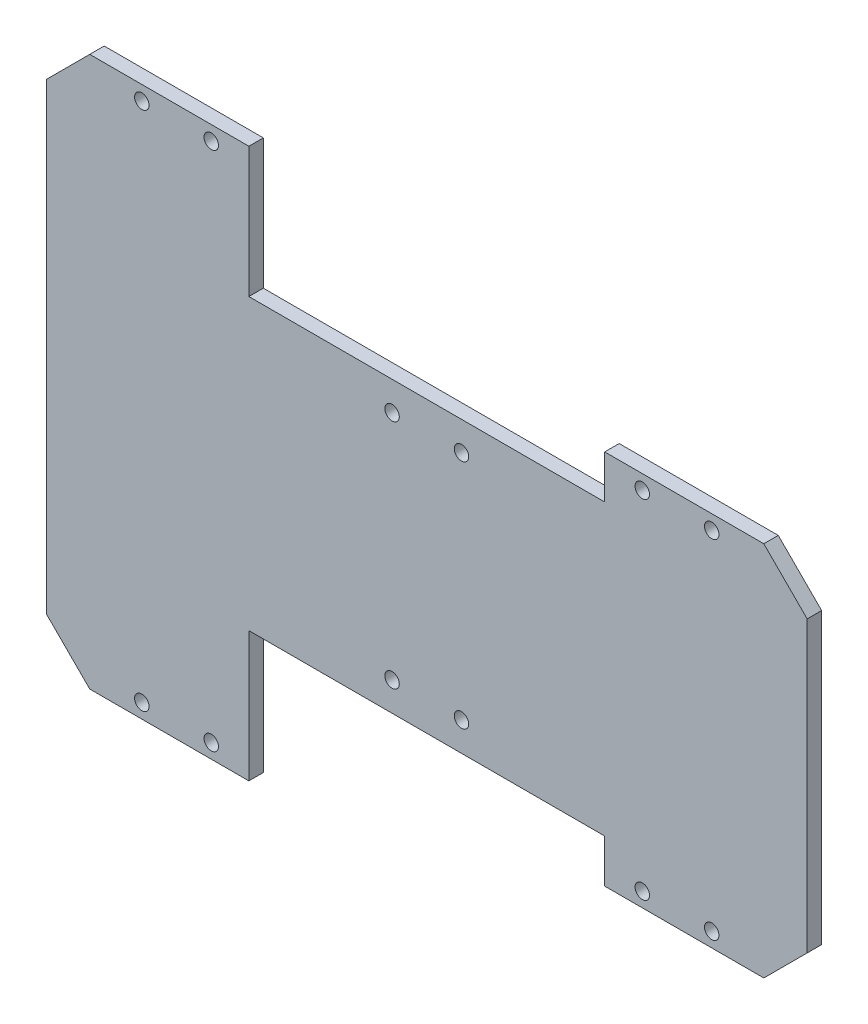
ISO-10303-21;
HEADER;
FILE_DESCRIPTION(('STEP AP214'),'2;1');
FILE_NAME('part.step','',(''),(''),'','','');
FILE_SCHEMA(('AUTOMOTIVE_DESIGN { 1 0 10303 214 1 1 1 1 }'));
ENDSEC;
DATA;
#1=APPLICATION_CONTEXT('core data for automotive mechanical design processes');
#2=APPLICATION_PROTOCOL_DEFINITION('international standard','automotive_design',2000,#1);
#3=PRODUCT_CONTEXT('',#1,'mechanical');
#4=PRODUCT('Part','Part','',(#3));
#5=PRODUCT_RELATED_PRODUCT_CATEGORY('part','',(#4));
#6=PRODUCT_DEFINITION_FORMATION('','',#4);
#7=PRODUCT_DEFINITION_CONTEXT('part definition',#1,'design');
#8=PRODUCT_DEFINITION('design','',#6,#7);
#9=PRODUCT_DEFINITION_SHAPE('','',#8);
#10=(LENGTH_UNIT() NAMED_UNIT(*) SI_UNIT(.MILLI.,.METRE.));
#11=(NAMED_UNIT(*) PLANE_ANGLE_UNIT() SI_UNIT($,.RADIAN.));
#12=(NAMED_UNIT(*) SI_UNIT($,.STERADIAN.) SOLID_ANGLE_UNIT());
#13=UNCERTAINTY_MEASURE_WITH_UNIT(LENGTH_MEASURE(1.E-05),#10,'distance_accuracy_value','');
#14=(GEOMETRIC_REPRESENTATION_CONTEXT(3) GLOBAL_UNCERTAINTY_ASSIGNED_CONTEXT((#13)) GLOBAL_UNIT_ASSIGNED_CONTEXT((#10,
#11,#12)) REPRESENTATION_CONTEXT('',''));
#15=CARTESIAN_POINT('',(0.,0.,0.));
#16=DIRECTION('',(0.,0.,1.));
#17=DIRECTION('',(1.,0.,0.));
#18=AXIS2_PLACEMENT_3D('',#15,#16,#17);
#19=CARTESIAN_POINT('',(-197.069969603607,-105.000000011249,0.));
#20=DIRECTION('',(-0.707106781186552,-0.707106781186543,0.));
#21=DIRECTION('',(0.707106781186543,-0.707106781186552,0.));
#22=AXIS2_PLACEMENT_3D('',#19,#20,#21);
#23=PLANE('',#22);
#24=DIRECTION('',(0.707106781186543,-0.707106781186552,0.));
#25=VECTOR('',#24,1.);
#26=CARTESIAN_POINT('',(-197.069969603607,-105.000000011249,5.));
#27=LINE('',#26,#25);
#28=CARTESIAN_POINT('',(-212.069969578106,-90.00000003675,5.));
#29=VERTEX_POINT('',#28);
#30=CARTESIAN_POINT('',(-197.069969603607,-105.000000011249,5.));
#31=VERTEX_POINT('',#30);
#32=EDGE_CURVE('E192',#29,#31,#27,.T.);
#33=ORIENTED_EDGE('',*,*,#32,.F.);
#34=DIRECTION('',(0.,0.,1.));
#35=VECTOR('',#34,1.);
#36=CARTESIAN_POINT('',(-212.069969578106,-90.00000003675,0.));
#37=LINE('',#36,#35);
#38=CARTESIAN_POINT('',(-212.069969578106,-90.00000003675,0.));
#39=VERTEX_POINT('',#38);
#40=EDGE_CURVE('E11',#39,#29,#37,.T.);
#41=ORIENTED_EDGE('',*,*,#40,.F.);
#42=DIRECTION('',(0.707106781186543,-0.707106781186552,0.));
#43=VECTOR('',#42,1.);
#44=CARTESIAN_POINT('',(-197.069969603607,-105.000000011249,0.));
#45=LINE('',#44,#43);
#46=CARTESIAN_POINT('',(-197.069969603607,-105.000000011249,0.));
#47=VERTEX_POINT('',#46);
#48=EDGE_CURVE('E253',#39,#47,#45,.T.);
#49=ORIENTED_EDGE('',*,*,#48,.T.);
#50=DIRECTION('',(0.,0.,1.));
#51=VECTOR('',#50,1.);
#52=CARTESIAN_POINT('',(-197.069969603607,-105.000000011249,0.));
#53=LINE('',#52,#51);
#54=EDGE_CURVE('E44',#47,#31,#53,.T.);
#55=ORIENTED_EDGE('',*,*,#54,.T.);
#56=EDGE_LOOP('',(#33,#41,#49,#55));
#57=FACE_BOUND('',#56,.T.);
#58=ADVANCED_FACE('F41',(#57),#23,.T.);
#59=CARTESIAN_POINT('',(-212.069969578105,70.0000000142508,0.));
#60=DIRECTION('',(-1.,0.,0.));
#61=DIRECTION('',(0.,-1.,0.));
#62=AXIS2_PLACEMENT_3D('',#59,#60,#61);
#63=PLANE('',#62);
#64=DIRECTION('',(0.,-1.,0.));
#65=VECTOR('',#64,1.);
#66=CARTESIAN_POINT('',(-212.069969578105,70.0000000142508,5.));
#67=LINE('',#66,#65);
#68=CARTESIAN_POINT('',(-212.069969578105,70.0000000142508,5.));
#69=VERTEX_POINT('',#68);
#70=EDGE_CURVE('E250',#69,#29,#67,.T.);
#71=ORIENTED_EDGE('',*,*,#70,.F.);
#72=DIRECTION('',(0.,0.,1.));
#73=VECTOR('',#72,1.);
#74=CARTESIAN_POINT('',(-212.069969578105,70.0000000142508,0.));
#75=LINE('',#74,#73);
#76=CARTESIAN_POINT('',(-212.069969578105,70.0000000142508,0.));
#77=VERTEX_POINT('',#76);
#78=EDGE_CURVE('E51',#77,#69,#75,.T.);
#79=ORIENTED_EDGE('',*,*,#78,.F.);
#80=DIRECTION('',(0.,-1.,0.));
#81=VECTOR('',#80,1.);
#82=CARTESIAN_POINT('',(-212.069969578105,70.0000000142508,0.));
#83=LINE('',#82,#81);
#84=EDGE_CURVE('E178',#77,#39,#83,.T.);
#85=ORIENTED_EDGE('',*,*,#84,.T.);
#86=ORIENTED_EDGE('',*,*,#40,.T.);
#87=EDGE_LOOP('',(#71,#79,#85,#86));
#88=FACE_BOUND('',#87,.T.);
#89=ADVANCED_FACE('F295',(#88),#63,.T.);
#90=CARTESIAN_POINT('',(-197.069969603606,84.99999998875,0.));
#91=DIRECTION('',(-0.707106781186549,0.707106781186546,0.));
#92=DIRECTION('',(-0.707106781186546,-0.707106781186549,0.));
#93=AXIS2_PLACEMENT_3D('',#90,#91,#92);
#94=PLANE('',#93);
#95=DIRECTION('',(-0.707106781186546,-0.707106781186549,0.));
#96=VECTOR('',#95,1.);
#97=CARTESIAN_POINT('',(-197.069969603606,84.99999998875,5.));
#98=LINE('',#97,#96);
#99=CARTESIAN_POINT('',(-197.069969603606,84.99999998875,5.));
#100=VERTEX_POINT('',#99);
#101=EDGE_CURVE('E164',#100,#69,#98,.T.);
#102=ORIENTED_EDGE('',*,*,#101,.F.);
#103=DIRECTION('',(0.,0.,1.));
#104=VECTOR('',#103,1.);
#105=CARTESIAN_POINT('',(-197.069969603606,84.99999998875,0.));
#106=LINE('',#105,#104);
#107=CARTESIAN_POINT('',(-197.069969603606,84.99999998875,0.));
#108=VERTEX_POINT('',#107);
#109=EDGE_CURVE('E159',#108,#100,#106,.T.);
#110=ORIENTED_EDGE('',*,*,#109,.F.);
#111=DIRECTION('',(-0.707106781186546,-0.707106781186549,0.));
#112=VECTOR('',#111,1.);
#113=CARTESIAN_POINT('',(-197.069969603606,84.99999998875,0.));
#114=LINE('',#113,#112);
#115=EDGE_CURVE('E162',#108,#77,#114,.T.);
#116=ORIENTED_EDGE('',*,*,#115,.T.);
#117=ORIENTED_EDGE('',*,*,#78,.T.);
#118=EDGE_LOOP('',(#102,#110,#116,#117));
#119=FACE_BOUND('',#118,.T.);
#120=ADVANCED_FACE('F161',(#119),#94,.T.);
#121=CARTESIAN_POINT('',(-142.069969573605,84.9999999887507,0.));
#122=DIRECTION('',(0.,1.,0.));
#123=DIRECTION('',(-1.,0.,0.));
#124=AXIS2_PLACEMENT_3D('',#121,#122,#123);
#125=PLANE('',#124);
#126=DIRECTION('',(-1.,0.,0.));
#127=VECTOR('',#126,1.);
#128=CARTESIAN_POINT('',(-142.069969573605,84.9999999887507,5.));
#129=LINE('',#128,#127);
#130=CARTESIAN_POINT('',(-142.069969573605,84.9999999887507,5.));
#131=VERTEX_POINT('',#130);
#132=EDGE_CURVE('E245',#131,#100,#129,.T.);
#133=ORIENTED_EDGE('',*,*,#132,.F.);
#134=DIRECTION('',(0.,0.,1.));
#135=VECTOR('',#134,1.);
#136=CARTESIAN_POINT('',(-142.069969573605,84.9999999887507,0.));
#137=LINE('',#136,#135);
#138=CARTESIAN_POINT('',(-142.069969573605,84.9999999887507,0.));
#139=VERTEX_POINT('',#138);
#140=EDGE_CURVE('E170',#139,#131,#137,.T.);
#141=ORIENTED_EDGE('',*,*,#140,.F.);
#142=DIRECTION('',(-1.,0.,0.));
#143=VECTOR('',#142,1.);
#144=CARTESIAN_POINT('',(-142.069969573605,84.9999999887507,0.));
#145=LINE('',#144,#143);
#146=EDGE_CURVE('E176',#139,#108,#145,.T.);
#147=ORIENTED_EDGE('',*,*,#146,.T.);
#148=ORIENTED_EDGE('',*,*,#109,.T.);
#149=EDGE_LOOP('',(#133,#141,#147,#148));
#150=FACE_BOUND('',#149,.T.);
#151=ADVANCED_FACE('F181',(#150),#125,.T.);
#152=CARTESIAN_POINT('',(-142.069969573605,39.9999999887507,0.));
#153=DIRECTION('',(1.,0.,0.));
#154=DIRECTION('',(0.,0.,-1.));
#155=AXIS2_PLACEMENT_3D('',#152,#153,#154);
#156=PLANE('',#155);
#157=DIRECTION('',(0.,1.,0.));
#158=VECTOR('',#157,1.);
#159=CARTESIAN_POINT('',(-142.069969573605,39.9999999887507,5.));
#160=LINE('',#159,#158);
#161=CARTESIAN_POINT('',(-142.069969573605,39.9999999887507,5.));
#162=VERTEX_POINT('',#161);
#163=EDGE_CURVE('E241',#162,#131,#160,.T.);
#164=ORIENTED_EDGE('',*,*,#163,.F.);
#165=DIRECTION('',(0.,0.,1.));
#166=VECTOR('',#165,1.);
#167=CARTESIAN_POINT('',(-142.069969573605,39.9999999887507,0.));
#168=LINE('',#167,#166);
#169=CARTESIAN_POINT('',(-142.069969573605,39.9999999887507,0.));
#170=VERTEX_POINT('',#169);
#171=EDGE_CURVE('E259',#170,#162,#168,.T.);
#172=ORIENTED_EDGE('',*,*,#171,.F.);
#173=DIRECTION('',(0.,1.,0.));
#174=VECTOR('',#173,1.);
#175=CARTESIAN_POINT('',(-142.069969573605,39.9999999887507,0.));
#176=LINE('',#175,#174);
#177=EDGE_CURVE('E183',#170,#139,#176,.T.);
#178=ORIENTED_EDGE('',*,*,#177,.T.);
#179=ORIENTED_EDGE('',*,*,#140,.T.);
#180=EDGE_LOOP('',(#164,#172,#178,#179));
#181=FACE_BOUND('',#180,.T.);
#182=ADVANCED_FACE('F308',(#181),#156,.T.);
#183=CARTESIAN_POINT('',(-19.0699695664799,39.99999998875,0.));
#184=DIRECTION('',(0.,1.,0.));
#185=DIRECTION('',(-1.,0.,0.));
#186=AXIS2_PLACEMENT_3D('',#183,#184,#185);
#187=PLANE('',#186);
#188=DIRECTION('',(-1.,0.,0.));
#189=VECTOR('',#188,1.);
#190=CARTESIAN_POINT('',(-19.0699695664799,39.99999998875,5.));
#191=LINE('',#190,#189);
#192=CARTESIAN_POINT('',(-19.0699695664799,39.99999998875,5.));
#193=VERTEX_POINT('',#192);
#194=EDGE_CURVE('E237',#193,#162,#191,.T.);
#195=ORIENTED_EDGE('',*,*,#194,.F.);
#196=DIRECTION('',(0.,0.,1.));
#197=VECTOR('',#196,1.);
#198=CARTESIAN_POINT('',(-19.0699695664799,39.99999998875,0.));
#199=LINE('',#198,#197);
#200=CARTESIAN_POINT('',(-19.0699695664799,39.99999998875,0.));
#201=VERTEX_POINT('',#200);
#202=EDGE_CURVE('E262',#201,#193,#199,.T.);
#203=ORIENTED_EDGE('',*,*,#202,.F.);
#204=DIRECTION('',(-1.,0.,0.));
#205=VECTOR('',#204,1.);
#206=CARTESIAN_POINT('',(-19.0699695664799,39.99999998875,0.));
#207=LINE('',#206,#205);
#208=EDGE_CURVE('E186',#201,#170,#207,.T.);
#209=ORIENTED_EDGE('',*,*,#208,.T.);
#210=ORIENTED_EDGE('',*,*,#171,.T.);
#211=EDGE_LOOP('',(#195,#203,#209,#210));
#212=FACE_BOUND('',#211,.T.);
#213=ADVANCED_FACE('F311',(#212),#187,.T.);
#214=CARTESIAN_POINT('',(-19.0699695664799,54.99999993775,0.));
#215=DIRECTION('',(-1.,0.,0.));
#216=DIRECTION('',(0.,-1.,0.));
#217=AXIS2_PLACEMENT_3D('',#214,#215,#216);
#218=PLANE('',#217);
#219=DIRECTION('',(0.,-1.,0.));
#220=VECTOR('',#219,1.);
#221=CARTESIAN_POINT('',(-19.0699695664799,54.99999993775,5.));
#222=LINE('',#221,#220);
#223=CARTESIAN_POINT('',(-19.0699695664799,54.99999993775,5.));
#224=VERTEX_POINT('',#223);
#225=EDGE_CURVE('E233',#224,#193,#222,.T.);
#226=ORIENTED_EDGE('',*,*,#225,.F.);
#227=DIRECTION('',(0.,0.,1.));
#228=VECTOR('',#227,1.);
#229=CARTESIAN_POINT('',(-19.0699695664799,54.99999993775,0.));
#230=LINE('',#229,#228);
#231=CARTESIAN_POINT('',(-19.0699695664799,54.99999993775,0.));
#232=VERTEX_POINT('',#231);
#233=EDGE_CURVE('E265',#232,#224,#230,.T.);
#234=ORIENTED_EDGE('',*,*,#233,.F.);
#235=DIRECTION('',(0.,-1.,0.));
#236=VECTOR('',#235,1.);
#237=CARTESIAN_POINT('',(-19.0699695664799,54.99999993775,0.));
#238=LINE('',#237,#236);
#239=EDGE_CURVE('E547',#232,#201,#238,.T.);
#240=ORIENTED_EDGE('',*,*,#239,.T.);
#241=ORIENTED_EDGE('',*,*,#202,.T.);
#242=EDGE_LOOP('',(#226,#234,#240,#241));
#243=FACE_BOUND('',#242,.T.);
#244=ADVANCED_FACE('F315',(#243),#218,.T.);
#245=CARTESIAN_POINT('',(35.9300304361448,54.99999993775,0.));
#246=DIRECTION('',(0.,1.,0.));
#247=DIRECTION('',(0.,0.,1.));
#248=AXIS2_PLACEMENT_3D('',#245,#246,#247);
#249=PLANE('',#248);
#250=DIRECTION('',(-1.,0.,0.));
#251=VECTOR('',#250,1.);
#252=CARTESIAN_POINT('',(35.9300304361448,54.99999993775,5.));
#253=LINE('',#252,#251);
#254=CARTESIAN_POINT('',(35.9300304361448,54.99999993775,5.));
#255=VERTEX_POINT('',#254);
#256=EDGE_CURVE('E229',#255,#224,#253,.T.);
#257=ORIENTED_EDGE('',*,*,#256,.F.);
#258=DIRECTION('',(0.,0.,1.));
#259=VECTOR('',#258,1.);
#260=CARTESIAN_POINT('',(35.9300304361448,54.99999993775,0.));
#261=LINE('',#260,#259);
#262=CARTESIAN_POINT('',(35.9300304361448,54.99999993775,0.));
#263=VERTEX_POINT('',#262);
#264=EDGE_CURVE('E268',#263,#255,#261,.T.);
#265=ORIENTED_EDGE('',*,*,#264,.F.);
#266=DIRECTION('',(-1.,0.,0.));
#267=VECTOR('',#266,1.);
#268=CARTESIAN_POINT('',(35.9300304361448,54.99999993775,0.));
#269=LINE('',#268,#267);
#270=EDGE_CURVE('E543',#263,#232,#269,.T.);
#271=ORIENTED_EDGE('',*,*,#270,.T.);
#272=ORIENTED_EDGE('',*,*,#233,.T.);
#273=EDGE_LOOP('',(#257,#265,#271,#272));
#274=FACE_BOUND('',#273,.T.);
#275=ADVANCED_FACE('F319',(#274),#249,.T.);
#276=CARTESIAN_POINT('',(50.9300304361448,39.99999993775,0.));
#277=DIRECTION('',(0.707106781186548,0.707106781186547,0.));
#278=DIRECTION('',(-0.707106781186547,0.707106781186548,0.));
#279=AXIS2_PLACEMENT_3D('',#276,#277,#278);
#280=PLANE('',#279);
#281=DIRECTION('',(-0.707106781186547,0.707106781186548,0.));
#282=VECTOR('',#281,1.);
#283=CARTESIAN_POINT('',(50.9300304361448,39.99999993775,5.));
#284=LINE('',#283,#282);
#285=CARTESIAN_POINT('',(50.9300304361448,39.99999993775,5.));
#286=VERTEX_POINT('',#285);
#287=EDGE_CURVE('E225',#286,#255,#284,.T.);
#288=ORIENTED_EDGE('',*,*,#287,.F.);
#289=DIRECTION('',(0.,0.,1.));
#290=VECTOR('',#289,1.);
#291=CARTESIAN_POINT('',(50.9300304361448,39.99999993775,0.));
#292=LINE('',#291,#290);
#293=CARTESIAN_POINT('',(50.9300304361448,39.99999993775,0.));
#294=VERTEX_POINT('',#293);
#295=EDGE_CURVE('E271',#294,#286,#292,.T.);
#296=ORIENTED_EDGE('',*,*,#295,.F.);
#297=DIRECTION('',(-0.707106781186547,0.707106781186548,0.));
#298=VECTOR('',#297,1.);
#299=CARTESIAN_POINT('',(50.9300304361448,39.99999993775,0.));
#300=LINE('',#299,#298);
#301=EDGE_CURVE('E539',#294,#263,#300,.T.);
#302=ORIENTED_EDGE('',*,*,#301,.T.);
#303=ORIENTED_EDGE('',*,*,#264,.T.);
#304=EDGE_LOOP('',(#288,#296,#302,#303));
#305=FACE_BOUND('',#304,.T.);
#306=ADVANCED_FACE('F323',(#305),#280,.T.);
#307=CARTESIAN_POINT('',(50.9300304361446,-59.9999999602504,0.));
#308=DIRECTION('',(1.,0.,0.));
#309=DIRECTION('',(0.,1.,0.));
#310=AXIS2_PLACEMENT_3D('',#307,#308,#309);
#311=PLANE('',#310);
#312=DIRECTION('',(0.,1.,0.));
#313=VECTOR('',#312,1.);
#314=CARTESIAN_POINT('',(50.9300304361446,-59.9999999602504,5.));
#315=LINE('',#314,#313);
#316=CARTESIAN_POINT('',(50.9300304361446,-59.9999999602504,5.));
#317=VERTEX_POINT('',#316);
#318=EDGE_CURVE('E221',#317,#286,#315,.T.);
#319=ORIENTED_EDGE('',*,*,#318,.F.);
#320=DIRECTION('',(0.,0.,1.));
#321=VECTOR('',#320,1.);
#322=CARTESIAN_POINT('',(50.9300304361446,-59.9999999602504,0.));
#323=LINE('',#322,#321);
#324=CARTESIAN_POINT('',(50.9300304361446,-59.9999999602504,0.));
#325=VERTEX_POINT('',#324);
#326=EDGE_CURVE('E274',#325,#317,#323,.T.);
#327=ORIENTED_EDGE('',*,*,#326,.F.);
#328=DIRECTION('',(0.,1.,0.));
#329=VECTOR('',#328,1.);
#330=CARTESIAN_POINT('',(50.9300304361446,-59.9999999602504,0.));
#331=LINE('',#330,#329);
#332=EDGE_CURVE('E535',#325,#294,#331,.T.);
#333=ORIENTED_EDGE('',*,*,#332,.T.);
#334=ORIENTED_EDGE('',*,*,#295,.T.);
#335=EDGE_LOOP('',(#319,#327,#333,#334));
#336=FACE_BOUND('',#335,.T.);
#337=ADVANCED_FACE('F327',(#336),#311,.T.);
#338=CARTESIAN_POINT('',(50.9300304361446,-59.9999999602504,0.));
#339=DIRECTION('',(0.707106781186546,-0.707106781186549,0.));
#340=DIRECTION('',(0.707106781186549,0.707106781186546,0.));
#341=AXIS2_PLACEMENT_3D('',#338,#339,#340);
#342=PLANE('',#341);
#343=DIRECTION('',(0.707106781186549,0.707106781186546,0.));
#344=VECTOR('',#343,1.);
#345=CARTESIAN_POINT('',(50.9300304361446,-59.9999999602504,5.));
#346=LINE('',#345,#344);
#347=CARTESIAN_POINT('',(35.9300304361445,-74.9999999602503,5.));
#348=VERTEX_POINT('',#347);
#349=EDGE_CURVE('E217',#348,#317,#346,.T.);
#350=ORIENTED_EDGE('',*,*,#349,.F.);
#351=DIRECTION('',(0.,0.,1.));
#352=VECTOR('',#351,1.);
#353=CARTESIAN_POINT('',(35.9300304361445,-74.9999999602503,0.));
#354=LINE('',#353,#352);
#355=CARTESIAN_POINT('',(35.9300304361445,-74.9999999602503,0.));
#356=VERTEX_POINT('',#355);
#357=EDGE_CURVE('E277',#356,#348,#354,.T.);
#358=ORIENTED_EDGE('',*,*,#357,.F.);
#359=DIRECTION('',(0.707106781186549,0.707106781186546,0.));
#360=VECTOR('',#359,1.);
#361=CARTESIAN_POINT('',(50.9300304361446,-59.9999999602504,0.));
#362=LINE('',#361,#360);
#363=EDGE_CURVE('E531',#356,#325,#362,.T.);
#364=ORIENTED_EDGE('',*,*,#363,.T.);
#365=ORIENTED_EDGE('',*,*,#326,.T.);
#366=EDGE_LOOP('',(#350,#358,#364,#365));
#367=FACE_BOUND('',#366,.T.);
#368=ADVANCED_FACE('F331',(#367),#342,.T.);
#369=CARTESIAN_POINT('',(35.9300304361445,-74.9999999602503,0.));
#370=DIRECTION('',(0.,-1.,0.));
#371=DIRECTION('',(1.,0.,0.));
#372=AXIS2_PLACEMENT_3D('',#369,#370,#371);
#373=PLANE('',#372);
#374=DIRECTION('',(1.,0.,0.));
#375=VECTOR('',#374,1.);
#376=CARTESIAN_POINT('',(35.9300304361445,-74.9999999602503,5.));
#377=LINE('',#376,#375);
#378=CARTESIAN_POINT('',(-19.0699695664801,-74.9999999602501,5.));
#379=VERTEX_POINT('',#378);
#380=EDGE_CURVE('E213',#379,#348,#377,.T.);
#381=ORIENTED_EDGE('',*,*,#380,.F.);
#382=DIRECTION('',(0.,0.,1.));
#383=VECTOR('',#382,1.);
#384=CARTESIAN_POINT('',(-19.0699695664801,-74.9999999602501,0.));
#385=LINE('',#384,#383);
#386=CARTESIAN_POINT('',(-19.0699695664801,-74.9999999602501,0.));
#387=VERTEX_POINT('',#386);
#388=EDGE_CURVE('E280',#387,#379,#385,.T.);
#389=ORIENTED_EDGE('',*,*,#388,.F.);
#390=DIRECTION('',(1.,0.,0.));
#391=VECTOR('',#390,1.);
#392=CARTESIAN_POINT('',(35.9300304361445,-74.9999999602503,0.));
#393=LINE('',#392,#391);
#394=EDGE_CURVE('E527',#387,#356,#393,.T.);
#395=ORIENTED_EDGE('',*,*,#394,.T.);
#396=ORIENTED_EDGE('',*,*,#357,.T.);
#397=EDGE_LOOP('',(#381,#389,#395,#396));
#398=FACE_BOUND('',#397,.T.);
#399=ADVANCED_FACE('F335',(#398),#373,.T.);
#400=CARTESIAN_POINT('',(-19.0699695664801,-74.9999999602501,0.));
#401=DIRECTION('',(-1.,0.,0.));
#402=DIRECTION('',(0.,-1.,0.));
#403=AXIS2_PLACEMENT_3D('',#400,#401,#402);
#404=PLANE('',#403);
#405=DIRECTION('',(0.,-1.,0.));
#406=VECTOR('',#405,1.);
#407=CARTESIAN_POINT('',(-19.0699695664801,-74.9999999602501,5.));
#408=LINE('',#407,#406);
#409=CARTESIAN_POINT('',(-19.0699695664801,-60.0000000112501,5.));
#410=VERTEX_POINT('',#409);
#411=EDGE_CURVE('E209',#410,#379,#408,.T.);
#412=ORIENTED_EDGE('',*,*,#411,.F.);
#413=DIRECTION('',(0.,0.,1.));
#414=VECTOR('',#413,1.);
#415=CARTESIAN_POINT('',(-19.0699695664801,-60.0000000112501,0.));
#416=LINE('',#415,#414);
#417=CARTESIAN_POINT('',(-19.0699695664801,-60.0000000112501,0.));
#418=VERTEX_POINT('',#417);
#419=EDGE_CURVE('E283',#418,#410,#416,.T.);
#420=ORIENTED_EDGE('',*,*,#419,.F.);
#421=DIRECTION('',(0.,-1.,0.));
#422=VECTOR('',#421,1.);
#423=CARTESIAN_POINT('',(-19.0699695664801,-74.9999999602501,0.));
#424=LINE('',#423,#422);
#425=EDGE_CURVE('E523',#418,#387,#424,.T.);
#426=ORIENTED_EDGE('',*,*,#425,.T.);
#427=ORIENTED_EDGE('',*,*,#388,.T.);
#428=EDGE_LOOP('',(#412,#420,#426,#427));
#429=FACE_BOUND('',#428,.T.);
#430=ADVANCED_FACE('F339',(#429),#404,.T.);
#431=CARTESIAN_POINT('',(-19.0699695664801,-60.0000000112501,0.));
#432=DIRECTION('',(0.,-1.,0.));
#433=DIRECTION('',(1.,0.,0.));
#434=AXIS2_PLACEMENT_3D('',#431,#432,#433);
#435=PLANE('',#434);
#436=DIRECTION('',(1.,0.,0.));
#437=VECTOR('',#436,1.);
#438=CARTESIAN_POINT('',(-19.0699695664801,-60.0000000112501,5.));
#439=LINE('',#438,#437);
#440=CARTESIAN_POINT('',(-142.069969573605,-60.0000000112502,5.));
#441=VERTEX_POINT('',#440);
#442=EDGE_CURVE('E205',#441,#410,#439,.T.);
#443=ORIENTED_EDGE('',*,*,#442,.F.);
#444=DIRECTION('',(0.,0.,1.));
#445=VECTOR('',#444,1.);
#446=CARTESIAN_POINT('',(-142.069969573605,-60.0000000112502,0.));
#447=LINE('',#446,#445);
#448=CARTESIAN_POINT('',(-142.069969573605,-60.0000000112502,0.));
#449=VERTEX_POINT('',#448);
#450=EDGE_CURVE('E286',#449,#441,#447,.T.);
#451=ORIENTED_EDGE('',*,*,#450,.F.);
#452=DIRECTION('',(1.,0.,0.));
#453=VECTOR('',#452,1.);
#454=CARTESIAN_POINT('',(-19.0699695664801,-60.0000000112501,0.));
#455=LINE('',#454,#453);
#456=EDGE_CURVE('E519',#449,#418,#455,.T.);
#457=ORIENTED_EDGE('',*,*,#456,.T.);
#458=ORIENTED_EDGE('',*,*,#419,.T.);
#459=EDGE_LOOP('',(#443,#451,#457,#458));
#460=FACE_BOUND('',#459,.T.);
#461=ADVANCED_FACE('F343',(#460),#435,.T.);
#462=CARTESIAN_POINT('',(-142.069969573605,-60.0000000112502,0.));
#463=DIRECTION('',(1.,0.,0.));
#464=DIRECTION('',(0.,1.,0.));
#465=AXIS2_PLACEMENT_3D('',#462,#463,#464);
#466=PLANE('',#465);
#467=DIRECTION('',(0.,1.,0.));
#468=VECTOR('',#467,1.);
#469=CARTESIAN_POINT('',(-142.069969573605,-60.0000000112502,5.));
#470=LINE('',#469,#468);
#471=CARTESIAN_POINT('',(-142.069969573605,-105.00000001125,5.));
#472=VERTEX_POINT('',#471);
#473=EDGE_CURVE('E201',#472,#441,#470,.T.);
#474=ORIENTED_EDGE('',*,*,#473,.F.);
#475=DIRECTION('',(0.,0.,1.));
#476=VECTOR('',#475,1.);
#477=CARTESIAN_POINT('',(-142.069969573605,-105.00000001125,0.));
#478=LINE('',#477,#476);
#479=CARTESIAN_POINT('',(-142.069969573605,-105.00000001125,0.));
#480=VERTEX_POINT('',#479);
#481=EDGE_CURVE('E288',#480,#472,#478,.T.);
#482=ORIENTED_EDGE('',*,*,#481,.F.);
#483=DIRECTION('',(0.,1.,0.));
#484=VECTOR('',#483,1.);
#485=CARTESIAN_POINT('',(-142.069969573605,-60.0000000112502,0.));
#486=LINE('',#485,#484);
#487=EDGE_CURVE('E515',#480,#449,#486,.T.);
#488=ORIENTED_EDGE('',*,*,#487,.T.);
#489=ORIENTED_EDGE('',*,*,#450,.T.);
#490=EDGE_LOOP('',(#474,#482,#488,#489));
#491=FACE_BOUND('',#490,.T.);
#492=ADVANCED_FACE('F347',(#491),#466,.T.);
#493=CARTESIAN_POINT('',(-142.069969573605,-105.00000001125,0.));
#494=DIRECTION('',(0.,-1.,0.));
#495=DIRECTION('',(1.,0.,0.));
#496=AXIS2_PLACEMENT_3D('',#493,#494,#495);
#497=PLANE('',#496);
#498=DIRECTION('',(1.,0.,0.));
#499=VECTOR('',#498,1.);
#500=CARTESIAN_POINT('',(-142.069969573605,-105.00000001125,5.));
#501=LINE('',#500,#499);
#502=EDGE_CURVE('E196',#31,#472,#501,.T.);
#503=ORIENTED_EDGE('',*,*,#502,.F.);
#504=ORIENTED_EDGE('',*,*,#54,.F.);
#505=DIRECTION('',(1.,0.,0.));
#506=VECTOR('',#505,1.);
#507=CARTESIAN_POINT('',(-142.069969573605,-105.00000001125,0.));
#508=LINE('',#507,#506);
#509=EDGE_CURVE('E512',#47,#480,#508,.T.);
#510=ORIENTED_EDGE('',*,*,#509,.T.);
#511=ORIENTED_EDGE('',*,*,#481,.T.);
#512=EDGE_LOOP('',(#503,#504,#510,#511));
#513=FACE_BOUND('',#512,.T.);
#514=ADVANCED_FACE('F292',(#513),#497,.T.);
#515=CARTESIAN_POINT('',(0.,0.,0.));
#516=DIRECTION('',(0.,0.,1.));
#517=DIRECTION('',(1.,0.,0.));
#518=AXIS2_PLACEMENT_3D('',#515,#516,#517);
#519=PLANE('',#518);
#520=CARTESIAN_POINT('',(17.9300304335202,49.9999999377477,0.));
#521=DIRECTION('',(0.,0.,1.));
#522=DIRECTION('',(1.,0.,0.));
#523=AXIS2_PLACEMENT_3D('',#520,#521,#522);
#524=CIRCLE('',#523,2.50000000000132);
#525=CARTESIAN_POINT('',(20.4300304335215,49.9999999377477,0.));
#526=VERTEX_POINT('',#525);
#527=EDGE_CURVE('E414',#526,#526,#524,.T.);
#528=ORIENTED_EDGE('',*,*,#527,.T.);
#529=EDGE_LOOP('',(#528));
#530=FACE_BOUND('',#529,.T.);
#531=CARTESIAN_POINT('',(-179.069969573605,79.99999998875,0.));
#532=DIRECTION('',(0.,0.,1.));
#533=DIRECTION('',(1.,0.,0.));
#534=AXIS2_PLACEMENT_3D('',#531,#532,#533);
#535=CIRCLE('',#534,2.5);
#536=CARTESIAN_POINT('',(-176.569969573605,79.99999998875,0.));
#537=VERTEX_POINT('',#536);
#538=EDGE_CURVE('E424',#537,#537,#535,.T.);
#539=ORIENTED_EDGE('',*,*,#538,.T.);
#540=EDGE_LOOP('',(#539));
#541=FACE_BOUND('',#540,.T.);
#542=CARTESIAN_POINT('',(-179.069969573605,-100.000000011249,0.));
#543=DIRECTION('',(0.,0.,1.));
#544=DIRECTION('',(-1.,0.,0.));
#545=AXIS2_PLACEMENT_3D('',#542,#543,#544);
#546=CIRCLE('',#545,2.5);
#547=CARTESIAN_POINT('',(-181.569969573605,-100.000000011249,0.));
#548=VERTEX_POINT('',#547);
#549=EDGE_CURVE('E432',#548,#548,#546,.T.);
#550=ORIENTED_EDGE('',*,*,#549,.T.);
#551=EDGE_LOOP('',(#550));
#552=FACE_BOUND('',#551,.T.);
#553=CARTESIAN_POINT('',(-68.5699695781056,30.0000000004351,0.));
#554=DIRECTION('',(0.,0.,1.));
#555=DIRECTION('',(-1.,0.,0.));
#556=AXIS2_PLACEMENT_3D('',#553,#554,#555);
#557=CIRCLE('',#556,2.50000000000001);
#558=CARTESIAN_POINT('',(-71.0699695781056,30.0000000004351,0.));
#559=VERTEX_POINT('',#558);
#560=EDGE_CURVE('E440',#559,#559,#557,.T.);
#561=ORIENTED_EDGE('',*,*,#560,.T.);
#562=EDGE_LOOP('',(#561));
#563=FACE_BOUND('',#562,.T.);
#564=CARTESIAN_POINT('',(-92.5699695781056,30.0000000116851,0.));
#565=DIRECTION('',(0.,0.,1.));
#566=DIRECTION('',(-1.,0.,0.));
#567=AXIS2_PLACEMENT_3D('',#564,#565,#566);
#568=CIRCLE('',#567,2.49999999999999);
#569=CARTESIAN_POINT('',(-95.0699695781056,30.0000000116851,0.));
#570=VERTEX_POINT('',#569);
#571=EDGE_CURVE('E448',#570,#570,#568,.T.);
#572=ORIENTED_EDGE('',*,*,#571,.T.);
#573=EDGE_LOOP('',(#572));
#574=FACE_BOUND('',#573,.T.);
#575=CARTESIAN_POINT('',(-6.06996956647969,-69.9999999602509,0.));
#576=DIRECTION('',(0.,0.,1.));
#577=DIRECTION('',(1.,0.,0.));
#578=AXIS2_PLACEMENT_3D('',#575,#576,#577);
#579=CIRCLE('',#578,2.50000000000001);
#580=CARTESIAN_POINT('',(-3.56996956647968,-69.9999999602509,0.));
#581=VERTEX_POINT('',#580);
#582=EDGE_CURVE('E456',#581,#581,#579,.T.);
#583=ORIENTED_EDGE('',*,*,#582,.T.);
#584=EDGE_LOOP('',(#583));
#585=FACE_BOUND('',#584,.T.);
#586=CARTESIAN_POINT('',(-155.069969573605,79.99999998875,0.));
#587=DIRECTION('',(0.,0.,1.));
#588=DIRECTION('',(-1.,0.,0.));
#589=AXIS2_PLACEMENT_3D('',#586,#587,#588);
#590=CIRCLE('',#589,2.5);
#591=CARTESIAN_POINT('',(-157.569969573605,79.99999998875,0.));
#592=VERTEX_POINT('',#591);
#593=EDGE_CURVE('E464',#592,#592,#590,.T.);
#594=ORIENTED_EDGE('',*,*,#593,.T.);
#595=EDGE_LOOP('',(#594));
#596=FACE_BOUND('',#595,.T.);
#597=CARTESIAN_POINT('',(-155.069969573605,-100.000000011249,0.));
#598=DIRECTION('',(0.,0.,1.));
#599=DIRECTION('',(1.,0.,0.));
#600=AXIS2_PLACEMENT_3D('',#597,#598,#599);
#601=CIRCLE('',#600,2.5);
#602=CARTESIAN_POINT('',(-152.569969573605,-100.000000011249,0.));
#603=VERTEX_POINT('',#602);
#604=EDGE_CURVE('E472',#603,#603,#601,.T.);
#605=ORIENTED_EDGE('',*,*,#604,.T.);
#606=EDGE_LOOP('',(#605));
#607=FACE_BOUND('',#606,.T.);
#608=CARTESIAN_POINT('',(-92.5699695781058,-50.0000000341848,0.));
#609=DIRECTION('',(0.,0.,1.));
#610=DIRECTION('',(1.,0.,0.));
#611=AXIS2_PLACEMENT_3D('',#608,#609,#610);
#612=CIRCLE('',#611,2.5);
#613=CARTESIAN_POINT('',(-90.0699695781058,-50.0000000341848,0.));
#614=VERTEX_POINT('',#613);
#615=EDGE_CURVE('E480',#614,#614,#612,.T.);
#616=ORIENTED_EDGE('',*,*,#615,.T.);
#617=EDGE_LOOP('',(#616));
#618=FACE_BOUND('',#617,.T.);
#619=CARTESIAN_POINT('',(-6.06996956647941,49.9999999377508,0.));
#620=DIRECTION('',(0.,0.,1.));
#621=DIRECTION('',(-1.,0.,0.));
#622=AXIS2_PLACEMENT_3D('',#619,#620,#621);
#623=CIRCLE('',#622,2.5);
#624=CARTESIAN_POINT('',(-8.56996956647942,49.9999999377508,0.));
#625=VERTEX_POINT('',#624);
#626=EDGE_CURVE('E488',#625,#625,#623,.T.);
#627=ORIENTED_EDGE('',*,*,#626,.T.);
#628=EDGE_LOOP('',(#627));
#629=FACE_BOUND('',#628,.T.);
#630=CARTESIAN_POINT('',(-68.5699695781057,-50.0000000229349,0.));
#631=DIRECTION('',(0.,0.,1.));
#632=DIRECTION('',(1.,0.,0.));
#633=AXIS2_PLACEMENT_3D('',#630,#631,#632);
#634=CIRCLE('',#633,2.50000000000001);
#635=CARTESIAN_POINT('',(-66.0699695781057,-50.0000000229349,0.));
#636=VERTEX_POINT('',#635);
#637=EDGE_CURVE('E496',#636,#636,#634,.T.);
#638=ORIENTED_EDGE('',*,*,#637,.T.);
#639=EDGE_LOOP('',(#638));
#640=FACE_BOUND('',#639,.T.);
#641=CARTESIAN_POINT('',(17.9300304335199,-69.9999999602479,0.));
#642=DIRECTION('',(0.,0.,1.));
#643=DIRECTION('',(-1.,0.,0.));
#644=AXIS2_PLACEMENT_3D('',#641,#642,#643);
#645=CIRCLE('',#644,2.50000000000133);
#646=CARTESIAN_POINT('',(15.4300304335185,-69.9999999602479,0.));
#647=VERTEX_POINT('',#646);
#648=EDGE_CURVE('E197',#647,#647,#645,.T.);
#649=ORIENTED_EDGE('',*,*,#648,.T.);
#650=EDGE_LOOP('',(#649));
#651=FACE_BOUND('',#650,.T.);
#652=ORIENTED_EDGE('',*,*,#48,.F.);
#653=ORIENTED_EDGE('',*,*,#84,.F.);
#654=ORIENTED_EDGE('',*,*,#115,.F.);
#655=ORIENTED_EDGE('',*,*,#146,.F.);
#656=ORIENTED_EDGE('',*,*,#177,.F.);
#657=ORIENTED_EDGE('',*,*,#208,.F.);
#658=ORIENTED_EDGE('',*,*,#239,.F.);
#659=ORIENTED_EDGE('',*,*,#270,.F.);
#660=ORIENTED_EDGE('',*,*,#301,.F.);
#661=ORIENTED_EDGE('',*,*,#332,.F.);
#662=ORIENTED_EDGE('',*,*,#363,.F.);
#663=ORIENTED_EDGE('',*,*,#394,.F.);
#664=ORIENTED_EDGE('',*,*,#425,.F.);
#665=ORIENTED_EDGE('',*,*,#456,.F.);
#666=ORIENTED_EDGE('',*,*,#487,.F.);
#667=ORIENTED_EDGE('',*,*,#509,.F.);
#668=EDGE_LOOP('',(#652,#653,#654,#655,#656,#657,#658,#659,#660,#661,#662,#663,#664,#665,#666,#667));
#669=FACE_BOUND('',#668,.T.);
#670=ADVANCED_FACE('F174',(#530,#541,#552,#563,#574,#585,#596,#607,#618,#629,#640,#651,#669),
#519,.F.);
#671=CARTESIAN_POINT('',(0.,0.,5.));
#672=DIRECTION('',(0.,0.,1.));
#673=DIRECTION('',(1.,0.,0.));
#674=AXIS2_PLACEMENT_3D('',#671,#672,#673);
#675=PLANE('',#674);
#676=CARTESIAN_POINT('',(17.9300304335202,49.9999999377477,5.));
#677=DIRECTION('',(0.,0.,1.));
#678=DIRECTION('',(1.,0.,0.));
#679=AXIS2_PLACEMENT_3D('',#676,#677,#678);
#680=CIRCLE('',#679,2.50000000000132);
#681=CARTESIAN_POINT('',(20.4300304335215,49.9999999377477,5.));
#682=VERTEX_POINT('',#681);
#683=EDGE_CURVE('E417',#682,#682,#680,.T.);
#684=ORIENTED_EDGE('',*,*,#683,.F.);
#685=EDGE_LOOP('',(#684));
#686=FACE_BOUND('',#685,.T.);
#687=CARTESIAN_POINT('',(-179.069969573605,79.99999998875,5.));
#688=DIRECTION('',(0.,0.,1.));
#689=DIRECTION('',(1.,0.,0.));
#690=AXIS2_PLACEMENT_3D('',#687,#688,#689);
#691=CIRCLE('',#690,2.5);
#692=CARTESIAN_POINT('',(-176.569969573605,79.99999998875,5.));
#693=VERTEX_POINT('',#692);
#694=EDGE_CURVE('E421',#693,#693,#691,.T.);
#695=ORIENTED_EDGE('',*,*,#694,.F.);
#696=EDGE_LOOP('',(#695));
#697=FACE_BOUND('',#696,.T.);
#698=CARTESIAN_POINT('',(-179.069969573605,-100.000000011249,5.));
#699=DIRECTION('',(0.,0.,1.));
#700=DIRECTION('',(-1.,0.,0.));
#701=AXIS2_PLACEMENT_3D('',#698,#699,#700);
#702=CIRCLE('',#701,2.5);
#703=CARTESIAN_POINT('',(-181.569969573605,-100.000000011249,5.));
#704=VERTEX_POINT('',#703);
#705=EDGE_CURVE('E428',#704,#704,#702,.T.);
#706=ORIENTED_EDGE('',*,*,#705,.F.);
#707=EDGE_LOOP('',(#706));
#708=FACE_BOUND('',#707,.T.);
#709=CARTESIAN_POINT('',(-68.5699695781056,30.0000000004351,5.));
#710=DIRECTION('',(0.,0.,1.));
#711=DIRECTION('',(-1.,0.,0.));
#712=AXIS2_PLACEMENT_3D('',#709,#710,#711);
#713=CIRCLE('',#712,2.50000000000001);
#714=CARTESIAN_POINT('',(-71.0699695781056,30.0000000004351,5.));
#715=VERTEX_POINT('',#714);
#716=EDGE_CURVE('E436',#715,#715,#713,.T.);
#717=ORIENTED_EDGE('',*,*,#716,.F.);
#718=EDGE_LOOP('',(#717));
#719=FACE_BOUND('',#718,.T.);
#720=CARTESIAN_POINT('',(-92.5699695781056,30.0000000116851,5.));
#721=DIRECTION('',(0.,0.,1.));
#722=DIRECTION('',(-1.,0.,0.));
#723=AXIS2_PLACEMENT_3D('',#720,#721,#722);
#724=CIRCLE('',#723,2.49999999999999);
#725=CARTESIAN_POINT('',(-95.0699695781056,30.0000000116851,5.));
#726=VERTEX_POINT('',#725);
#727=EDGE_CURVE('E444',#726,#726,#724,.T.);
#728=ORIENTED_EDGE('',*,*,#727,.F.);
#729=EDGE_LOOP('',(#728));
#730=FACE_BOUND('',#729,.T.);
#731=CARTESIAN_POINT('',(-6.06996956647969,-69.9999999602509,5.));
#732=DIRECTION('',(0.,0.,1.));
#733=DIRECTION('',(1.,0.,0.));
#734=AXIS2_PLACEMENT_3D('',#731,#732,#733);
#735=CIRCLE('',#734,2.50000000000001);
#736=CARTESIAN_POINT('',(-3.56996956647968,-69.9999999602509,5.));
#737=VERTEX_POINT('',#736);
#738=EDGE_CURVE('E452',#737,#737,#735,.T.);
#739=ORIENTED_EDGE('',*,*,#738,.F.);
#740=EDGE_LOOP('',(#739));
#741=FACE_BOUND('',#740,.T.);
#742=CARTESIAN_POINT('',(-155.069969573605,79.99999998875,5.));
#743=DIRECTION('',(0.,0.,1.));
#744=DIRECTION('',(-1.,0.,0.));
#745=AXIS2_PLACEMENT_3D('',#742,#743,#744);
#746=CIRCLE('',#745,2.5);
#747=CARTESIAN_POINT('',(-157.569969573605,79.99999998875,5.));
#748=VERTEX_POINT('',#747);
#749=EDGE_CURVE('E460',#748,#748,#746,.T.);
#750=ORIENTED_EDGE('',*,*,#749,.F.);
#751=EDGE_LOOP('',(#750));
#752=FACE_BOUND('',#751,.T.);
#753=CARTESIAN_POINT('',(-155.069969573605,-100.000000011249,5.));
#754=DIRECTION('',(0.,0.,1.));
#755=DIRECTION('',(1.,0.,0.));
#756=AXIS2_PLACEMENT_3D('',#753,#754,#755);
#757=CIRCLE('',#756,2.5);
#758=CARTESIAN_POINT('',(-152.569969573605,-100.000000011249,5.));
#759=VERTEX_POINT('',#758);
#760=EDGE_CURVE('E468',#759,#759,#757,.T.);
#761=ORIENTED_EDGE('',*,*,#760,.F.);
#762=EDGE_LOOP('',(#761));
#763=FACE_BOUND('',#762,.T.);
#764=CARTESIAN_POINT('',(-92.5699695781058,-50.0000000341848,5.));
#765=DIRECTION('',(0.,0.,1.));
#766=DIRECTION('',(1.,0.,0.));
#767=AXIS2_PLACEMENT_3D('',#764,#765,#766);
#768=CIRCLE('',#767,2.5);
#769=CARTESIAN_POINT('',(-90.0699695781058,-50.0000000341848,5.));
#770=VERTEX_POINT('',#769);
#771=EDGE_CURVE('E476',#770,#770,#768,.T.);
#772=ORIENTED_EDGE('',*,*,#771,.F.);
#773=EDGE_LOOP('',(#772));
#774=FACE_BOUND('',#773,.T.);
#775=CARTESIAN_POINT('',(-6.06996956647941,49.9999999377508,5.));
#776=DIRECTION('',(0.,0.,1.));
#777=DIRECTION('',(-1.,0.,0.));
#778=AXIS2_PLACEMENT_3D('',#775,#776,#777);
#779=CIRCLE('',#778,2.5);
#780=CARTESIAN_POINT('',(-8.56996956647942,49.9999999377508,5.));
#781=VERTEX_POINT('',#780);
#782=EDGE_CURVE('E484',#781,#781,#779,.T.);
#783=ORIENTED_EDGE('',*,*,#782,.F.);
#784=EDGE_LOOP('',(#783));
#785=FACE_BOUND('',#784,.T.);
#786=CARTESIAN_POINT('',(-68.5699695781057,-50.0000000229349,5.));
#787=DIRECTION('',(0.,0.,1.));
#788=DIRECTION('',(1.,0.,0.));
#789=AXIS2_PLACEMENT_3D('',#786,#787,#788);
#790=CIRCLE('',#789,2.50000000000001);
#791=CARTESIAN_POINT('',(-66.0699695781057,-50.0000000229349,5.));
#792=VERTEX_POINT('',#791);
#793=EDGE_CURVE('E492',#792,#792,#790,.T.);
#794=ORIENTED_EDGE('',*,*,#793,.F.);
#795=EDGE_LOOP('',(#794));
#796=FACE_BOUND('',#795,.T.);
#797=CARTESIAN_POINT('',(17.9300304335199,-69.9999999602479,5.));
#798=DIRECTION('',(0.,0.,1.));
#799=DIRECTION('',(-1.,0.,0.));
#800=AXIS2_PLACEMENT_3D('',#797,#798,#799);
#801=CIRCLE('',#800,2.50000000000133);
#802=CARTESIAN_POINT('',(15.4300304335185,-69.9999999602479,5.));
#803=VERTEX_POINT('',#802);
#804=EDGE_CURVE('E500',#803,#803,#801,.T.);
#805=ORIENTED_EDGE('',*,*,#804,.F.);
#806=EDGE_LOOP('',(#805));
#807=FACE_BOUND('',#806,.T.);
#808=ORIENTED_EDGE('',*,*,#32,.T.);
#809=ORIENTED_EDGE('',*,*,#502,.T.);
#810=ORIENTED_EDGE('',*,*,#473,.T.);
#811=ORIENTED_EDGE('',*,*,#442,.T.);
#812=ORIENTED_EDGE('',*,*,#411,.T.);
#813=ORIENTED_EDGE('',*,*,#380,.T.);
#814=ORIENTED_EDGE('',*,*,#349,.T.);
#815=ORIENTED_EDGE('',*,*,#318,.T.);
#816=ORIENTED_EDGE('',*,*,#287,.T.);
#817=ORIENTED_EDGE('',*,*,#256,.T.);
#818=ORIENTED_EDGE('',*,*,#225,.T.);
#819=ORIENTED_EDGE('',*,*,#194,.T.);
#820=ORIENTED_EDGE('',*,*,#163,.T.);
#821=ORIENTED_EDGE('',*,*,#132,.T.);
#822=ORIENTED_EDGE('',*,*,#101,.T.);
#823=ORIENTED_EDGE('',*,*,#70,.T.);
#824=EDGE_LOOP('',(#808,#809,#810,#811,#812,#813,#814,#815,#816,#817,#818,#819,#820,#821,#822,#823));
#825=FACE_BOUND('',#824,.T.);
#826=ADVANCED_FACE('F294',(#686,#697,#708,#719,#730,#741,#752,#763,#774,#785,#796,#807,#825),
#675,.T.);
#827=CARTESIAN_POINT('',(17.9300304335199,-69.9999999602479,0.));
#828=DIRECTION('',(0.,0.,1.));
#829=DIRECTION('',(1.,0.,0.));
#830=AXIS2_PLACEMENT_3D('',#827,#828,#829);
#831=CYLINDRICAL_SURFACE('',#830,2.50000000000133);
#832=ORIENTED_EDGE('',*,*,#648,.F.);
#833=EDGE_LOOP('',(#832));
#834=FACE_BOUND('',#833,.T.);
#835=ORIENTED_EDGE('',*,*,#804,.T.);
#836=EDGE_LOOP('',(#835));
#837=FACE_BOUND('',#836,.T.);
#838=ADVANCED_FACE('F359',(#834,#837),#831,.F.);
#839=CARTESIAN_POINT('',(-68.5699695781057,-50.0000000229349,0.));
#840=DIRECTION('',(0.,0.,1.));
#841=DIRECTION('',(1.,0.,0.));
#842=AXIS2_PLACEMENT_3D('',#839,#840,#841);
#843=CYLINDRICAL_SURFACE('',#842,2.50000000000001);
#844=ORIENTED_EDGE('',*,*,#637,.F.);
#845=EDGE_LOOP('',(#844));
#846=FACE_BOUND('',#845,.T.);
#847=ORIENTED_EDGE('',*,*,#793,.T.);
#848=EDGE_LOOP('',(#847));
#849=FACE_BOUND('',#848,.T.);
#850=ADVANCED_FACE('F366',(#846,#849),#843,.F.);
#851=CARTESIAN_POINT('',(-6.06996956647941,49.9999999377508,0.));
#852=DIRECTION('',(0.,0.,1.));
#853=DIRECTION('',(1.,0.,0.));
#854=AXIS2_PLACEMENT_3D('',#851,#852,#853);
#855=CYLINDRICAL_SURFACE('',#854,2.5);
#856=ORIENTED_EDGE('',*,*,#626,.F.);
#857=EDGE_LOOP('',(#856));
#858=FACE_BOUND('',#857,.T.);
#859=ORIENTED_EDGE('',*,*,#782,.T.);
#860=EDGE_LOOP('',(#859));
#861=FACE_BOUND('',#860,.T.);
#862=ADVANCED_FACE('F370',(#858,#861),#855,.F.);
#863=CARTESIAN_POINT('',(-92.5699695781058,-50.0000000341848,0.));
#864=DIRECTION('',(0.,0.,1.));
#865=DIRECTION('',(1.,0.,0.));
#866=AXIS2_PLACEMENT_3D('',#863,#864,#865);
#867=CYLINDRICAL_SURFACE('',#866,2.5);
#868=ORIENTED_EDGE('',*,*,#615,.F.);
#869=EDGE_LOOP('',(#868));
#870=FACE_BOUND('',#869,.T.);
#871=ORIENTED_EDGE('',*,*,#771,.T.);
#872=EDGE_LOOP('',(#871));
#873=FACE_BOUND('',#872,.T.);
#874=ADVANCED_FACE('F374',(#870,#873),#867,.F.);
#875=CARTESIAN_POINT('',(-155.069969573605,-100.000000011249,0.));
#876=DIRECTION('',(0.,0.,1.));
#877=DIRECTION('',(1.,0.,0.));
#878=AXIS2_PLACEMENT_3D('',#875,#876,#877);
#879=CYLINDRICAL_SURFACE('',#878,2.5);
#880=ORIENTED_EDGE('',*,*,#604,.F.);
#881=EDGE_LOOP('',(#880));
#882=FACE_BOUND('',#881,.T.);
#883=ORIENTED_EDGE('',*,*,#760,.T.);
#884=EDGE_LOOP('',(#883));
#885=FACE_BOUND('',#884,.T.);
#886=ADVANCED_FACE('F378',(#882,#885),#879,.F.);
#887=CARTESIAN_POINT('',(-155.069969573605,79.99999998875,0.));
#888=DIRECTION('',(0.,0.,1.));
#889=DIRECTION('',(1.,0.,0.));
#890=AXIS2_PLACEMENT_3D('',#887,#888,#889);
#891=CYLINDRICAL_SURFACE('',#890,2.5);
#892=ORIENTED_EDGE('',*,*,#593,.F.);
#893=EDGE_LOOP('',(#892));
#894=FACE_BOUND('',#893,.T.);
#895=ORIENTED_EDGE('',*,*,#749,.T.);
#896=EDGE_LOOP('',(#895));
#897=FACE_BOUND('',#896,.T.);
#898=ADVANCED_FACE('F382',(#894,#897),#891,.F.);
#899=CARTESIAN_POINT('',(-6.06996956647969,-69.9999999602509,0.));
#900=DIRECTION('',(0.,0.,1.));
#901=DIRECTION('',(1.,0.,0.));
#902=AXIS2_PLACEMENT_3D('',#899,#900,#901);
#903=CYLINDRICAL_SURFACE('',#902,2.50000000000001);
#904=ORIENTED_EDGE('',*,*,#582,.F.);
#905=EDGE_LOOP('',(#904));
#906=FACE_BOUND('',#905,.T.);
#907=ORIENTED_EDGE('',*,*,#738,.T.);
#908=EDGE_LOOP('',(#907));
#909=FACE_BOUND('',#908,.T.);
#910=ADVANCED_FACE('F386',(#906,#909),#903,.F.);
#911=CARTESIAN_POINT('',(-92.5699695781056,30.0000000116851,0.));
#912=DIRECTION('',(0.,0.,1.));
#913=DIRECTION('',(1.,0.,0.));
#914=AXIS2_PLACEMENT_3D('',#911,#912,#913);
#915=CYLINDRICAL_SURFACE('',#914,2.49999999999999);
#916=ORIENTED_EDGE('',*,*,#571,.F.);
#917=EDGE_LOOP('',(#916));
#918=FACE_BOUND('',#917,.T.);
#919=ORIENTED_EDGE('',*,*,#727,.T.);
#920=EDGE_LOOP('',(#919));
#921=FACE_BOUND('',#920,.T.);
#922=ADVANCED_FACE('F390',(#918,#921),#915,.F.);
#923=CARTESIAN_POINT('',(-68.5699695781056,30.0000000004351,0.));
#924=DIRECTION('',(0.,0.,1.));
#925=DIRECTION('',(1.,0.,0.));
#926=AXIS2_PLACEMENT_3D('',#923,#924,#925);
#927=CYLINDRICAL_SURFACE('',#926,2.50000000000001);
#928=ORIENTED_EDGE('',*,*,#560,.F.);
#929=EDGE_LOOP('',(#928));
#930=FACE_BOUND('',#929,.T.);
#931=ORIENTED_EDGE('',*,*,#716,.T.);
#932=EDGE_LOOP('',(#931));
#933=FACE_BOUND('',#932,.T.);
#934=ADVANCED_FACE('F394',(#930,#933),#927,.F.);
#935=CARTESIAN_POINT('',(-179.069969573605,-100.000000011249,0.));
#936=DIRECTION('',(0.,0.,1.));
#937=DIRECTION('',(1.,0.,0.));
#938=AXIS2_PLACEMENT_3D('',#935,#936,#937);
#939=CYLINDRICAL_SURFACE('',#938,2.5);
#940=ORIENTED_EDGE('',*,*,#549,.F.);
#941=EDGE_LOOP('',(#940));
#942=FACE_BOUND('',#941,.T.);
#943=ORIENTED_EDGE('',*,*,#705,.T.);
#944=EDGE_LOOP('',(#943));
#945=FACE_BOUND('',#944,.T.);
#946=ADVANCED_FACE('F398',(#942,#945),#939,.F.);
#947=CARTESIAN_POINT('',(-179.069969573605,79.99999998875,0.));
#948=DIRECTION('',(0.,0.,1.));
#949=DIRECTION('',(1.,0.,0.));
#950=AXIS2_PLACEMENT_3D('',#947,#948,#949);
#951=CYLINDRICAL_SURFACE('',#950,2.5);
#952=ORIENTED_EDGE('',*,*,#538,.F.);
#953=EDGE_LOOP('',(#952));
#954=FACE_BOUND('',#953,.T.);
#955=ORIENTED_EDGE('',*,*,#694,.T.);
#956=EDGE_LOOP('',(#955));
#957=FACE_BOUND('',#956,.T.);
#958=ADVANCED_FACE('F402',(#954,#957),#951,.F.);
#959=CARTESIAN_POINT('',(17.9300304335202,49.9999999377477,0.));
#960=DIRECTION('',(0.,0.,1.));
#961=DIRECTION('',(1.,0.,0.));
#962=AXIS2_PLACEMENT_3D('',#959,#960,#961);
#963=CYLINDRICAL_SURFACE('',#962,2.50000000000132);
#964=ORIENTED_EDGE('',*,*,#527,.F.);
#965=EDGE_LOOP('',(#964));
#966=FACE_BOUND('',#965,.T.);
#967=ORIENTED_EDGE('',*,*,#683,.T.);
#968=EDGE_LOOP('',(#967));
#969=FACE_BOUND('',#968,.T.);
#970=ADVANCED_FACE('F406',(#966,#969),#963,.F.);
#971=CLOSED_SHELL('',(#58,#89,#120,#151,#182,#213,#244,#275,#306,#337,#368,#399,#430,#461,#492,
#514,#670,#826,#838,#850,#862,#874,#886,#898,#910,#922,#934,#946,#958,#970));
#972=MANIFOLD_SOLID_BREP('B2',#971);
#973=ADVANCED_BREP_SHAPE_REPRESENTATION('',(#18,#972),#14);
#974=SHAPE_DEFINITION_REPRESENTATION(#9,#973);
ENDSEC;
END-ISO-10303-21;
